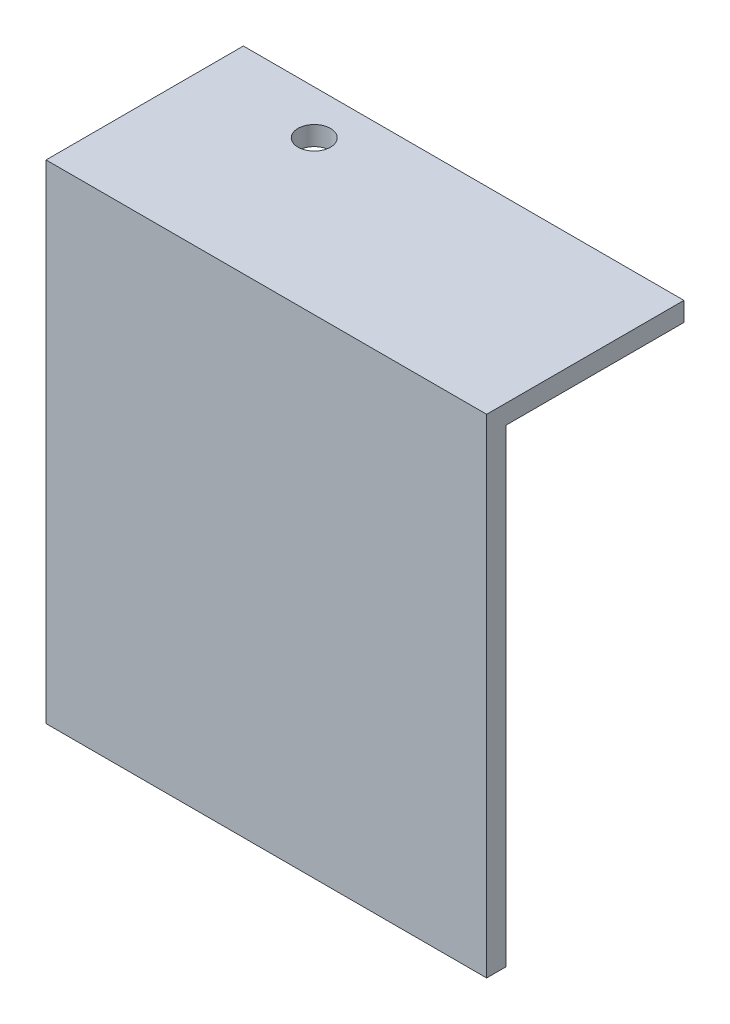
ISO-10303-21;
HEADER;
FILE_DESCRIPTION(('STEP AP214'),'2;1');
FILE_NAME('part.step','',(''),(''),'','','');
FILE_SCHEMA(('AUTOMOTIVE_DESIGN { 1 0 10303 214 1 1 1 1 }'));
ENDSEC;
DATA;
#1=APPLICATION_CONTEXT('core data for automotive mechanical design processes');
#2=APPLICATION_PROTOCOL_DEFINITION('international standard','automotive_design',2000,#1);
#3=PRODUCT_CONTEXT('',#1,'mechanical');
#4=PRODUCT('Part','Part','',(#3));
#5=PRODUCT_RELATED_PRODUCT_CATEGORY('part','',(#4));
#6=PRODUCT_DEFINITION_FORMATION('','',#4);
#7=PRODUCT_DEFINITION_CONTEXT('part definition',#1,'design');
#8=PRODUCT_DEFINITION('design','',#6,#7);
#9=PRODUCT_DEFINITION_SHAPE('','',#8);
#10=(LENGTH_UNIT() NAMED_UNIT(*) SI_UNIT(.MILLI.,.METRE.));
#11=(NAMED_UNIT(*) PLANE_ANGLE_UNIT() SI_UNIT($,.RADIAN.));
#12=(NAMED_UNIT(*) SI_UNIT($,.STERADIAN.) SOLID_ANGLE_UNIT());
#13=UNCERTAINTY_MEASURE_WITH_UNIT(LENGTH_MEASURE(1.E-05),#10,'distance_accuracy_value','');
#14=(GEOMETRIC_REPRESENTATION_CONTEXT(3) GLOBAL_UNCERTAINTY_ASSIGNED_CONTEXT((#13)) GLOBAL_UNIT_ASSIGNED_CONTEXT((#10,
#11,#12)) REPRESENTATION_CONTEXT('',''));
#15=CARTESIAN_POINT('',(0.,0.,0.));
#16=DIRECTION('',(0.,0.,1.));
#17=DIRECTION('',(1.,0.,0.));
#18=AXIS2_PLACEMENT_3D('',#15,#16,#17);
#19=CARTESIAN_POINT('',(0.,0.,0.));
#20=DIRECTION('',(0.,0.,1.));
#21=DIRECTION('',(1.,0.,0.));
#22=AXIS2_PLACEMENT_3D('',#19,#20,#21);
#23=PLANE('',#22);
#24=DIRECTION('',(-1.,0.,0.));
#25=VECTOR('',#24,1.);
#26=CARTESIAN_POINT('',(115.,122.43,0.));
#27=LINE('',#26,#25);
#28=CARTESIAN_POINT('',(115.,122.43,0.));
#29=VERTEX_POINT('',#28);
#30=CARTESIAN_POINT('',(0.,122.43,0.));
#31=VERTEX_POINT('',#30);
#32=EDGE_CURVE('E56',#29,#31,#27,.T.);
#33=ORIENTED_EDGE('',*,*,#32,.F.);
#34=DIRECTION('',(0.,1.,0.));
#35=VECTOR('',#34,1.);
#36=CARTESIAN_POINT('',(115.,0.,0.));
#37=LINE('',#36,#35);
#38=CARTESIAN_POINT('',(115.,0.,0.));
#39=VERTEX_POINT('',#38);
#40=EDGE_CURVE('E124',#39,#29,#37,.T.);
#41=ORIENTED_EDGE('',*,*,#40,.F.);
#42=DIRECTION('',(1.,0.,0.));
#43=VECTOR('',#42,1.);
#44=CARTESIAN_POINT('',(0.,0.,0.));
#45=LINE('',#44,#43);
#46=CARTESIAN_POINT('',(0.,0.,0.));
#47=VERTEX_POINT('',#46);
#48=EDGE_CURVE('E126',#47,#39,#45,.T.);
#49=ORIENTED_EDGE('',*,*,#48,.F.);
#50=DIRECTION('',(0.,1.,0.));
#51=VECTOR('',#50,1.);
#52=CARTESIAN_POINT('',(0.,0.,0.));
#53=LINE('',#52,#51);
#54=EDGE_CURVE('E137',#47,#31,#53,.T.);
#55=ORIENTED_EDGE('',*,*,#54,.T.);
#56=EDGE_LOOP('',(#33,#41,#49,#55));
#57=FACE_BOUND('',#56,.T.);
#58=ADVANCED_FACE('F39',(#57),#23,.F.);
#59=CARTESIAN_POINT('',(0.,0.,5.));
#60=DIRECTION('',(0.,1.,0.));
#61=DIRECTION('',(0.,0.,1.));
#62=AXIS2_PLACEMENT_3D('',#59,#60,#61);
#63=PLANE('',#62);
#64=ORIENTED_EDGE('',*,*,#48,.T.);
#65=DIRECTION('',(0.,0.,-1.));
#66=VECTOR('',#65,1.);
#67=CARTESIAN_POINT('',(115.,0.,5.));
#68=LINE('',#67,#66);
#69=CARTESIAN_POINT('',(115.,0.,5.));
#70=VERTEX_POINT('',#69);
#71=EDGE_CURVE('E11',#70,#39,#68,.T.);
#72=ORIENTED_EDGE('',*,*,#71,.F.);
#73=DIRECTION('',(1.,0.,0.));
#74=VECTOR('',#73,1.);
#75=CARTESIAN_POINT('',(0.,0.,5.));
#76=LINE('',#75,#74);
#77=CARTESIAN_POINT('',(0.,0.,5.));
#78=VERTEX_POINT('',#77);
#79=EDGE_CURVE('E134',#78,#70,#76,.T.);
#80=ORIENTED_EDGE('',*,*,#79,.F.);
#81=DIRECTION('',(0.,0.,-1.));
#82=VECTOR('',#81,1.);
#83=CARTESIAN_POINT('',(0.,0.,5.));
#84=LINE('',#83,#82);
#85=EDGE_CURVE('E65',#78,#47,#84,.T.);
#86=ORIENTED_EDGE('',*,*,#85,.T.);
#87=EDGE_LOOP('',(#64,#72,#80,#86));
#88=FACE_BOUND('',#87,.T.);
#89=ADVANCED_FACE('F41',(#88),#63,.F.);
#90=CARTESIAN_POINT('',(115.,0.,5.));
#91=DIRECTION('',(-1.,0.,0.));
#92=DIRECTION('',(0.,0.,1.));
#93=AXIS2_PLACEMENT_3D('',#90,#91,#92);
#94=PLANE('',#93);
#95=ORIENTED_EDGE('',*,*,#40,.T.);
#96=DIRECTION('',(0.,0.,1.));
#97=VECTOR('',#96,1.);
#98=CARTESIAN_POINT('',(115.,122.43,-46.5));
#99=LINE('',#98,#97);
#100=CARTESIAN_POINT('',(115.,122.43,-46.5));
#101=VERTEX_POINT('',#100);
#102=EDGE_CURVE('E106',#101,#29,#99,.T.);
#103=ORIENTED_EDGE('',*,*,#102,.F.);
#104=DIRECTION('',(0.,-1.,0.));
#105=VECTOR('',#104,1.);
#106=CARTESIAN_POINT('',(115.,127.43,-46.5));
#107=LINE('',#106,#105);
#108=CARTESIAN_POINT('',(115.,127.43,-46.5));
#109=VERTEX_POINT('',#108);
#110=EDGE_CURVE('E114',#109,#101,#107,.T.);
#111=ORIENTED_EDGE('',*,*,#110,.F.);
#112=DIRECTION('',(0.,0.,-1.));
#113=VECTOR('',#112,1.);
#114=CARTESIAN_POINT('',(115.,127.43,5.));
#115=LINE('',#114,#113);
#116=CARTESIAN_POINT('',(115.,127.43,5.));
#117=VERTEX_POINT('',#116);
#118=EDGE_CURVE('E49',#117,#109,#115,.T.);
#119=ORIENTED_EDGE('',*,*,#118,.F.);
#120=DIRECTION('',(0.,1.,0.));
#121=VECTOR('',#120,1.);
#122=CARTESIAN_POINT('',(115.,0.,5.));
#123=LINE('',#122,#121);
#124=EDGE_CURVE('E84',#70,#117,#123,.T.);
#125=ORIENTED_EDGE('',*,*,#124,.F.);
#126=ORIENTED_EDGE('',*,*,#71,.T.);
#127=EDGE_LOOP('',(#95,#103,#111,#119,#125,#126));
#128=FACE_BOUND('',#127,.T.);
#129=ADVANCED_FACE('F123',(#128),#94,.F.);
#130=CARTESIAN_POINT('',(0.,127.43,5.));
#131=DIRECTION('',(0.,1.,0.));
#132=DIRECTION('',(0.,0.,1.));
#133=AXIS2_PLACEMENT_3D('',#130,#131,#132);
#134=PLANE('',#133);
#135=CARTESIAN_POINT('',(30.,127.43,-35.));
#136=DIRECTION('',(0.,1.,0.));
#137=DIRECTION('',(0.,0.,1.));
#138=AXIS2_PLACEMENT_3D('',#135,#136,#137);
#139=CIRCLE('',#138,4.25);
#140=CARTESIAN_POINT('',(30.,127.43,-30.75));
#141=VERTEX_POINT('',#140);
#142=EDGE_CURVE('E171',#141,#141,#139,.T.);
#143=ORIENTED_EDGE('',*,*,#142,.F.);
#144=EDGE_LOOP('',(#143));
#145=FACE_BOUND('',#144,.T.);
#146=ORIENTED_EDGE('',*,*,#118,.T.);
#147=DIRECTION('',(1.,0.,0.));
#148=VECTOR('',#147,1.);
#149=CARTESIAN_POINT('',(115.,127.43,-46.5));
#150=LINE('',#149,#148);
#151=CARTESIAN_POINT('',(0.,127.43,-46.5));
#152=VERTEX_POINT('',#151);
#153=EDGE_CURVE('E120',#152,#109,#150,.T.);
#154=ORIENTED_EDGE('',*,*,#153,.F.);
#155=DIRECTION('',(0.,0.,-1.));
#156=VECTOR('',#155,1.);
#157=CARTESIAN_POINT('',(0.,127.43,5.));
#158=LINE('',#157,#156);
#159=CARTESIAN_POINT('',(0.,127.43,5.));
#160=VERTEX_POINT('',#159);
#161=EDGE_CURVE('E153',#160,#152,#158,.T.);
#162=ORIENTED_EDGE('',*,*,#161,.F.);
#163=DIRECTION('',(1.,0.,0.));
#164=VECTOR('',#163,1.);
#165=CARTESIAN_POINT('',(0.,127.43,5.));
#166=LINE('',#165,#164);
#167=EDGE_CURVE('E140',#160,#117,#166,.T.);
#168=ORIENTED_EDGE('',*,*,#167,.T.);
#169=EDGE_LOOP('',(#146,#154,#162,#168));
#170=FACE_BOUND('',#169,.T.);
#171=ADVANCED_FACE('F158',(#145,#170),#134,.T.);
#172=CARTESIAN_POINT('',(0.,0.,5.));
#173=DIRECTION('',(-1.,0.,0.));
#174=DIRECTION('',(0.,0.,1.));
#175=AXIS2_PLACEMENT_3D('',#172,#173,#174);
#176=PLANE('',#175);
#177=ORIENTED_EDGE('',*,*,#54,.F.);
#178=ORIENTED_EDGE('',*,*,#85,.F.);
#179=DIRECTION('',(0.,1.,0.));
#180=VECTOR('',#179,1.);
#181=CARTESIAN_POINT('',(0.,0.,5.));
#182=LINE('',#181,#180);
#183=EDGE_CURVE('E144',#78,#160,#182,.T.);
#184=ORIENTED_EDGE('',*,*,#183,.T.);
#185=ORIENTED_EDGE('',*,*,#161,.T.);
#186=DIRECTION('',(0.,1.,0.));
#187=VECTOR('',#186,1.);
#188=CARTESIAN_POINT('',(0.,127.43,-46.5));
#189=LINE('',#188,#187);
#190=CARTESIAN_POINT('',(0.,122.43,-46.5));
#191=VERTEX_POINT('',#190);
#192=EDGE_CURVE('E113',#191,#152,#189,.T.);
#193=ORIENTED_EDGE('',*,*,#192,.F.);
#194=DIRECTION('',(0.,0.,1.));
#195=VECTOR('',#194,1.);
#196=CARTESIAN_POINT('',(0.,122.43,-46.5));
#197=LINE('',#196,#195);
#198=EDGE_CURVE('E108',#191,#31,#197,.T.);
#199=ORIENTED_EDGE('',*,*,#198,.T.);
#200=EDGE_LOOP('',(#177,#178,#184,#185,#193,#199));
#201=FACE_BOUND('',#200,.T.);
#202=ADVANCED_FACE('F163',(#201),#176,.T.);
#203=CARTESIAN_POINT('',(0.,0.,5.));
#204=DIRECTION('',(0.,0.,1.));
#205=DIRECTION('',(1.,0.,0.));
#206=AXIS2_PLACEMENT_3D('',#203,#204,#205);
#207=PLANE('',#206);
#208=ORIENTED_EDGE('',*,*,#79,.T.);
#209=ORIENTED_EDGE('',*,*,#124,.T.);
#210=ORIENTED_EDGE('',*,*,#167,.F.);
#211=ORIENTED_EDGE('',*,*,#183,.F.);
#212=EDGE_LOOP('',(#208,#209,#210,#211));
#213=FACE_BOUND('',#212,.T.);
#214=ADVANCED_FACE('F162',(#213),#207,.T.);
#215=CARTESIAN_POINT('',(115.,122.43,-46.5));
#216=DIRECTION('',(0.,1.,0.));
#217=DIRECTION('',(-1.,0.,0.));
#218=AXIS2_PLACEMENT_3D('',#215,#216,#217);
#219=PLANE('',#218);
#220=CARTESIAN_POINT('',(30.,122.43,-35.));
#221=DIRECTION('',(0.,1.,0.));
#222=DIRECTION('',(-1.,0.,0.));
#223=AXIS2_PLACEMENT_3D('',#220,#221,#222);
#224=CIRCLE('',#223,4.25);
#225=CARTESIAN_POINT('',(25.75,122.43,-35.));
#226=VERTEX_POINT('',#225);
#227=EDGE_CURVE('E43',#226,#226,#224,.T.);
#228=ORIENTED_EDGE('',*,*,#227,.T.);
#229=EDGE_LOOP('',(#228));
#230=FACE_BOUND('',#229,.T.);
#231=ORIENTED_EDGE('',*,*,#32,.T.);
#232=ORIENTED_EDGE('',*,*,#198,.F.);
#233=DIRECTION('',(-1.,0.,0.));
#234=VECTOR('',#233,1.);
#235=CARTESIAN_POINT('',(115.,122.43,-46.5));
#236=LINE('',#235,#234);
#237=EDGE_CURVE('E102',#101,#191,#236,.T.);
#238=ORIENTED_EDGE('',*,*,#237,.F.);
#239=ORIENTED_EDGE('',*,*,#102,.T.);
#240=EDGE_LOOP('',(#231,#232,#238,#239));
#241=FACE_BOUND('',#240,.T.);
#242=ADVANCED_FACE('F104',(#230,#241),#219,.F.);
#243=CARTESIAN_POINT('',(0.,0.,-46.5));
#244=DIRECTION('',(0.,0.,-1.));
#245=DIRECTION('',(-1.,0.,0.));
#246=AXIS2_PLACEMENT_3D('',#243,#244,#245);
#247=PLANE('',#246);
#248=ORIENTED_EDGE('',*,*,#110,.T.);
#249=ORIENTED_EDGE('',*,*,#237,.T.);
#250=ORIENTED_EDGE('',*,*,#192,.T.);
#251=ORIENTED_EDGE('',*,*,#153,.T.);
#252=EDGE_LOOP('',(#248,#249,#250,#251));
#253=FACE_BOUND('',#252,.T.);
#254=ADVANCED_FACE('F118',(#253),#247,.T.);
#255=CARTESIAN_POINT('',(30.,0.,-35.));
#256=DIRECTION('',(0.,1.,0.));
#257=DIRECTION('',(0.,0.,1.));
#258=AXIS2_PLACEMENT_3D('',#255,#256,#257);
#259=CYLINDRICAL_SURFACE('',#258,4.25);
#260=ORIENTED_EDGE('',*,*,#142,.T.);
#261=EDGE_LOOP('',(#260));
#262=FACE_BOUND('',#261,.T.);
#263=ORIENTED_EDGE('',*,*,#227,.F.);
#264=EDGE_LOOP('',(#263));
#265=FACE_BOUND('',#264,.T.);
#266=ADVANCED_FACE('F179',(#262,#265),#259,.F.);
#267=CLOSED_SHELL('',(#58,#89,#129,#171,#202,#214,#242,#254,#266));
#268=MANIFOLD_SOLID_BREP('B2',#267);
#269=ADVANCED_BREP_SHAPE_REPRESENTATION('',(#18,#268),#14);
#270=SHAPE_DEFINITION_REPRESENTATION(#9,#269);
ENDSEC;
END-ISO-10303-21;
